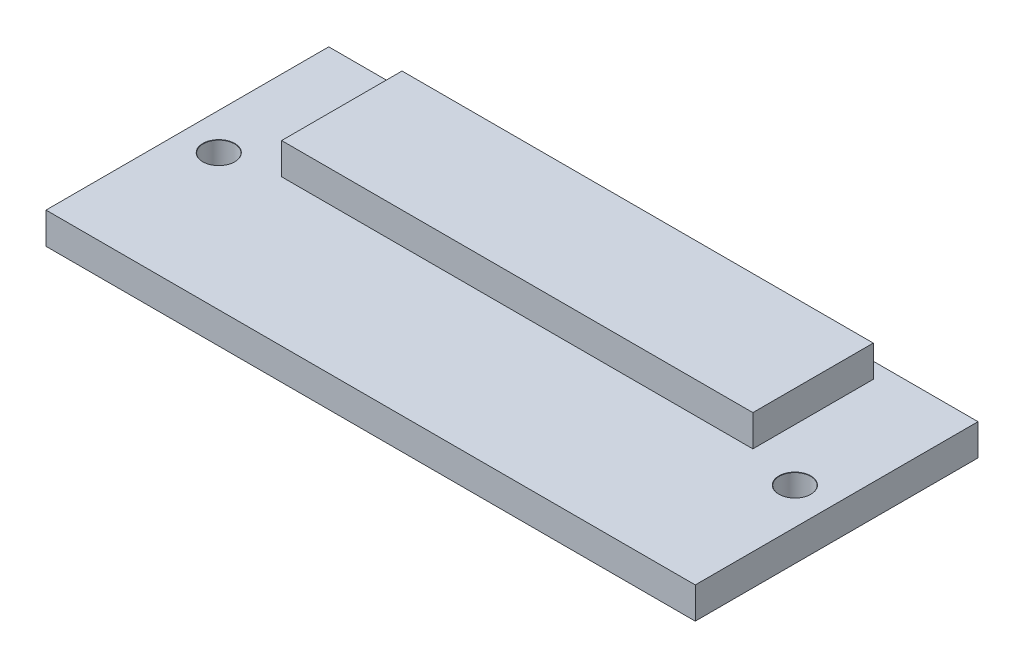
ISO-10303-21;
HEADER;
FILE_DESCRIPTION(('STEP AP214'),'2;1');
FILE_NAME('part.step','',(''),(''),'','','');
FILE_SCHEMA(('AUTOMOTIVE_DESIGN { 1 0 10303 214 1 1 1 1 }'));
ENDSEC;
DATA;
#1=APPLICATION_CONTEXT('core data for automotive mechanical design processes');
#2=APPLICATION_PROTOCOL_DEFINITION('international standard','automotive_design',2000,#1);
#3=PRODUCT_CONTEXT('',#1,'mechanical');
#4=PRODUCT('Part','Part','',(#3));
#5=PRODUCT_RELATED_PRODUCT_CATEGORY('part','',(#4));
#6=PRODUCT_DEFINITION_FORMATION('','',#4);
#7=PRODUCT_DEFINITION_CONTEXT('part definition',#1,'design');
#8=PRODUCT_DEFINITION('design','',#6,#7);
#9=PRODUCT_DEFINITION_SHAPE('','',#8);
#10=(LENGTH_UNIT() NAMED_UNIT(*) SI_UNIT(.MILLI.,.METRE.));
#11=(NAMED_UNIT(*) PLANE_ANGLE_UNIT() SI_UNIT($,.RADIAN.));
#12=(NAMED_UNIT(*) SI_UNIT($,.STERADIAN.) SOLID_ANGLE_UNIT());
#13=UNCERTAINTY_MEASURE_WITH_UNIT(LENGTH_MEASURE(1.E-05),#10,'distance_accuracy_value','');
#14=(GEOMETRIC_REPRESENTATION_CONTEXT(3) GLOBAL_UNCERTAINTY_ASSIGNED_CONTEXT((#13)) GLOBAL_UNIT_ASSIGNED_CONTEXT((#10,
#11,#12)) REPRESENTATION_CONTEXT('',''));
#15=CARTESIAN_POINT('',(0.,0.,0.));
#16=DIRECTION('',(0.,0.,1.));
#17=DIRECTION('',(1.,0.,0.));
#18=AXIS2_PLACEMENT_3D('',#15,#16,#17);
#19=CARTESIAN_POINT('',(8.5,6.,-25.5));
#20=DIRECTION('',(1.,0.,0.));
#21=DIRECTION('',(0.,0.,-1.));
#22=AXIS2_PLACEMENT_3D('',#19,#20,#21);
#23=PLANE('',#22);
#24=DIRECTION('',(0.,0.,1.));
#25=VECTOR('',#24,1.);
#26=CARTESIAN_POINT('',(8.5,3.,-25.5));
#27=LINE('',#26,#25);
#28=CARTESIAN_POINT('',(8.5,3.,-25.5));
#29=VERTEX_POINT('',#28);
#30=CARTESIAN_POINT('',(8.5,3.,-14.));
#31=VERTEX_POINT('',#30);
#32=EDGE_CURVE('E112',#29,#31,#27,.T.);
#33=ORIENTED_EDGE('',*,*,#32,.T.);
#34=DIRECTION('',(0.,-1.,0.));
#35=VECTOR('',#34,1.);
#36=CARTESIAN_POINT('',(8.5,6.,-14.));
#37=LINE('',#36,#35);
#38=CARTESIAN_POINT('',(8.5,6.,-14.));
#39=VERTEX_POINT('',#38);
#40=EDGE_CURVE('E12',#39,#31,#37,.T.);
#41=ORIENTED_EDGE('',*,*,#40,.F.);
#42=DIRECTION('',(0.,0.,1.));
#43=VECTOR('',#42,1.);
#44=CARTESIAN_POINT('',(8.5,6.,-25.5));
#45=LINE('',#44,#43);
#46=CARTESIAN_POINT('',(8.5,6.,-25.5));
#47=VERTEX_POINT('',#46);
#48=EDGE_CURVE('E100',#47,#39,#45,.T.);
#49=ORIENTED_EDGE('',*,*,#48,.F.);
#50=DIRECTION('',(0.,-1.,0.));
#51=VECTOR('',#50,1.);
#52=CARTESIAN_POINT('',(8.5,6.,-25.5));
#53=LINE('',#52,#51);
#54=EDGE_CURVE('E108',#47,#29,#53,.T.);
#55=ORIENTED_EDGE('',*,*,#54,.T.);
#56=EDGE_LOOP('',(#33,#41,#49,#55));
#57=FACE_BOUND('',#56,.T.);
#58=ADVANCED_FACE('F49',(#57),#23,.F.);
#59=CARTESIAN_POINT('',(8.5,6.,-14.));
#60=DIRECTION('',(0.,0.,-1.));
#61=DIRECTION('',(-1.,0.,0.));
#62=AXIS2_PLACEMENT_3D('',#59,#60,#61);
#63=PLANE('',#62);
#64=DIRECTION('',(1.,0.,0.));
#65=VECTOR('',#64,1.);
#66=CARTESIAN_POINT('',(8.5,3.,-14.));
#67=LINE('',#66,#65);
#68=CARTESIAN_POINT('',(53.5,3.,-14.));
#69=VERTEX_POINT('',#68);
#70=EDGE_CURVE('E104',#31,#69,#67,.T.);
#71=ORIENTED_EDGE('',*,*,#70,.T.);
#72=DIRECTION('',(0.,-1.,0.));
#73=VECTOR('',#72,1.);
#74=CARTESIAN_POINT('',(53.5,6.,-14.));
#75=LINE('',#74,#73);
#76=CARTESIAN_POINT('',(53.5,6.,-14.));
#77=VERTEX_POINT('',#76);
#78=EDGE_CURVE('E57',#77,#69,#75,.T.);
#79=ORIENTED_EDGE('',*,*,#78,.F.);
#80=DIRECTION('',(1.,0.,0.));
#81=VECTOR('',#80,1.);
#82=CARTESIAN_POINT('',(8.5,6.,-14.));
#83=LINE('',#82,#81);
#84=EDGE_CURVE('E95',#39,#77,#83,.T.);
#85=ORIENTED_EDGE('',*,*,#84,.F.);
#86=ORIENTED_EDGE('',*,*,#40,.T.);
#87=EDGE_LOOP('',(#71,#79,#85,#86));
#88=FACE_BOUND('',#87,.T.);
#89=ADVANCED_FACE('F103',(#88),#63,.F.);
#90=CARTESIAN_POINT('',(53.5,6.,-25.5));
#91=DIRECTION('',(-1.,0.,0.));
#92=DIRECTION('',(0.,0.,1.));
#93=AXIS2_PLACEMENT_3D('',#90,#91,#92);
#94=PLANE('',#93);
#95=DIRECTION('',(0.,0.,-1.));
#96=VECTOR('',#95,1.);
#97=CARTESIAN_POINT('',(53.5,3.,-25.5));
#98=LINE('',#97,#96);
#99=CARTESIAN_POINT('',(53.5,3.,-25.5));
#100=VERTEX_POINT('',#99);
#101=EDGE_CURVE('E82',#69,#100,#98,.T.);
#102=ORIENTED_EDGE('',*,*,#101,.T.);
#103=DIRECTION('',(0.,-1.,0.));
#104=VECTOR('',#103,1.);
#105=CARTESIAN_POINT('',(53.5,6.,-25.5));
#106=LINE('',#105,#104);
#107=CARTESIAN_POINT('',(53.5,6.,-25.5));
#108=VERTEX_POINT('',#107);
#109=EDGE_CURVE('E105',#108,#100,#106,.T.);
#110=ORIENTED_EDGE('',*,*,#109,.F.);
#111=DIRECTION('',(0.,0.,-1.));
#112=VECTOR('',#111,1.);
#113=CARTESIAN_POINT('',(53.5,6.,-25.5));
#114=LINE('',#113,#112);
#115=EDGE_CURVE('E98',#77,#108,#114,.T.);
#116=ORIENTED_EDGE('',*,*,#115,.F.);
#117=ORIENTED_EDGE('',*,*,#78,.T.);
#118=EDGE_LOOP('',(#102,#110,#116,#117));
#119=FACE_BOUND('',#118,.T.);
#120=ADVANCED_FACE('F106',(#119),#94,.F.);
#121=CARTESIAN_POINT('',(8.5,6.,-25.5));
#122=DIRECTION('',(0.,0.,1.));
#123=DIRECTION('',(1.,0.,0.));
#124=AXIS2_PLACEMENT_3D('',#121,#122,#123);
#125=PLANE('',#124);
#126=DIRECTION('',(-1.,0.,0.));
#127=VECTOR('',#126,1.);
#128=CARTESIAN_POINT('',(8.5,3.,-25.5));
#129=LINE('',#128,#127);
#130=EDGE_CURVE('E88',#100,#29,#129,.T.);
#131=ORIENTED_EDGE('',*,*,#130,.T.);
#132=ORIENTED_EDGE('',*,*,#54,.F.);
#133=DIRECTION('',(-1.,0.,0.));
#134=VECTOR('',#133,1.);
#135=CARTESIAN_POINT('',(8.5,6.,-25.5));
#136=LINE('',#135,#134);
#137=EDGE_CURVE('E65',#108,#47,#136,.T.);
#138=ORIENTED_EDGE('',*,*,#137,.F.);
#139=ORIENTED_EDGE('',*,*,#109,.T.);
#140=EDGE_LOOP('',(#131,#132,#138,#139));
#141=FACE_BOUND('',#140,.T.);
#142=ADVANCED_FACE('F119',(#141),#125,.F.);
#143=CARTESIAN_POINT('',(0.,6.,0.));
#144=DIRECTION('',(0.,1.,0.));
#145=DIRECTION('',(0.,0.,1.));
#146=AXIS2_PLACEMENT_3D('',#143,#144,#145);
#147=PLANE('',#146);
#148=ORIENTED_EDGE('',*,*,#48,.T.);
#149=ORIENTED_EDGE('',*,*,#84,.T.);
#150=ORIENTED_EDGE('',*,*,#115,.T.);
#151=ORIENTED_EDGE('',*,*,#137,.T.);
#152=EDGE_LOOP('',(#148,#149,#150,#151));
#153=FACE_BOUND('',#152,.T.);
#154=ADVANCED_FACE('F96',(#153),#147,.T.);
#155=CARTESIAN_POINT('',(0.,3.,0.));
#156=DIRECTION('',(0.,1.,0.));
#157=DIRECTION('',(0.,0.,1.));
#158=AXIS2_PLACEMENT_3D('',#155,#156,#157);
#159=PLANE('',#158);
#160=ORIENTED_EDGE('',*,*,#32,.F.);
#161=ORIENTED_EDGE('',*,*,#130,.F.);
#162=ORIENTED_EDGE('',*,*,#101,.F.);
#163=ORIENTED_EDGE('',*,*,#70,.F.);
#164=EDGE_LOOP('',(#160,#161,#162,#163));
#165=FACE_BOUND('',#164,.T.);
#166=ADVANCED_FACE('F122',(#165),#159,.F.);
#167=CLOSED_SHELL('',(#58,#89,#120,#142,#154,#166));
#168=MANIFOLD_SOLID_BREP('B2',#167);
#169=CARTESIAN_POINT('',(0.,3.,0.));
#170=DIRECTION('',(0.,-1.,0.));
#171=DIRECTION('',(0.,0.,-1.));
#172=AXIS2_PLACEMENT_3D('',#169,#170,#171);
#173=PLANE('',#172);
#174=DIRECTION('',(1.,0.,0.));
#175=VECTOR('',#174,1.);
#176=CARTESIAN_POINT('',(8.5,3.,-14.));
#177=LINE('',#176,#175);
#178=CARTESIAN_POINT('',(8.5,3.,-14.));
#179=VERTEX_POINT('',#178);
#180=CARTESIAN_POINT('',(53.5,3.,-14.));
#181=VERTEX_POINT('',#180);
#182=EDGE_CURVE('E273',#179,#181,#177,.T.);
#183=ORIENTED_EDGE('',*,*,#182,.F.);
#184=DIRECTION('',(0.,0.,1.));
#185=VECTOR('',#184,1.);
#186=CARTESIAN_POINT('',(8.5,3.,-25.5));
#187=LINE('',#186,#185);
#188=CARTESIAN_POINT('',(8.5,3.,-25.5));
#189=VERTEX_POINT('',#188);
#190=EDGE_CURVE('E189',#189,#179,#187,.T.);
#191=ORIENTED_EDGE('',*,*,#190,.F.);
#192=DIRECTION('',(-1.,0.,0.));
#193=VECTOR('',#192,1.);
#194=CARTESIAN_POINT('',(8.5,3.,-25.5));
#195=LINE('',#194,#193);
#196=CARTESIAN_POINT('',(53.5,3.,-25.5));
#197=VERTEX_POINT('',#196);
#198=EDGE_CURVE('E260',#197,#189,#195,.T.);
#199=ORIENTED_EDGE('',*,*,#198,.F.);
#200=DIRECTION('',(0.,0.,-1.));
#201=VECTOR('',#200,1.);
#202=CARTESIAN_POINT('',(53.5,3.,-25.5));
#203=LINE('',#202,#201);
#204=EDGE_CURVE('E264',#181,#197,#203,.T.);
#205=ORIENTED_EDGE('',*,*,#204,.F.);
#206=EDGE_LOOP('',(#183,#191,#199,#205));
#207=FACE_BOUND('',#206,.T.);
#208=CARTESIAN_POINT('',(3.5,3.,-13.));
#209=DIRECTION('',(0.,1.,0.));
#210=DIRECTION('',(0.,0.,1.));
#211=AXIS2_PLACEMENT_3D('',#208,#209,#210);
#212=CIRCLE('',#211,1.525);
#213=CARTESIAN_POINT('',(3.5,3.,-11.475));
#214=VERTEX_POINT('',#213);
#215=EDGE_CURVE('E282',#214,#214,#212,.T.);
#216=ORIENTED_EDGE('',*,*,#215,.F.);
#217=EDGE_LOOP('',(#216));
#218=FACE_BOUND('',#217,.T.);
#219=DIRECTION('',(0.,0.,1.));
#220=VECTOR('',#219,1.);
#221=CARTESIAN_POINT('',(0.,3.,0.));
#222=LINE('',#221,#220);
#223=CARTESIAN_POINT('',(0.,3.,-27.));
#224=VERTEX_POINT('',#223);
#225=CARTESIAN_POINT('',(0.,3.,0.));
#226=VERTEX_POINT('',#225);
#227=EDGE_CURVE('E312',#224,#226,#222,.T.);
#228=ORIENTED_EDGE('',*,*,#227,.T.);
#229=DIRECTION('',(1.,0.,0.));
#230=VECTOR('',#229,1.);
#231=CARTESIAN_POINT('',(0.,3.,0.));
#232=LINE('',#231,#230);
#233=CARTESIAN_POINT('',(62.,3.,0.));
#234=VERTEX_POINT('',#233);
#235=EDGE_CURVE('E316',#226,#234,#232,.T.);
#236=ORIENTED_EDGE('',*,*,#235,.T.);
#237=DIRECTION('',(0.,0.,-1.));
#238=VECTOR('',#237,1.);
#239=CARTESIAN_POINT('',(62.,3.,0.));
#240=LINE('',#239,#238);
#241=CARTESIAN_POINT('',(62.,3.,-27.));
#242=VERTEX_POINT('',#241);
#243=EDGE_CURVE('E320',#234,#242,#240,.T.);
#244=ORIENTED_EDGE('',*,*,#243,.T.);
#245=DIRECTION('',(-1.,0.,0.));
#246=VECTOR('',#245,1.);
#247=CARTESIAN_POINT('',(0.,3.,-27.));
#248=LINE('',#247,#246);
#249=EDGE_CURVE('E323',#242,#224,#248,.T.);
#250=ORIENTED_EDGE('',*,*,#249,.T.);
#251=EDGE_LOOP('',(#228,#236,#244,#250));
#252=FACE_BOUND('',#251,.T.);
#253=CARTESIAN_POINT('',(58.4999981781058,3.,-13.0141565659629));
#254=DIRECTION('',(0.,1.,0.));
#255=DIRECTION('',(0.,0.,1.));
#256=AXIS2_PLACEMENT_3D('',#253,#254,#255);
#257=CIRCLE('',#256,1.525);
#258=CARTESIAN_POINT('',(58.4999981781058,3.,-11.4891565659629));
#259=VERTEX_POINT('',#258);
#260=EDGE_CURVE('E299',#259,#259,#257,.T.);
#261=ORIENTED_EDGE('',*,*,#260,.F.);
#262=EDGE_LOOP('',(#261));
#263=FACE_BOUND('',#262,.T.);
#264=ADVANCED_FACE('F173',(#207,#218,#252,#263),#173,.F.);
#265=CARTESIAN_POINT('',(0.,0.,0.));
#266=DIRECTION('',(0.,-1.,0.));
#267=DIRECTION('',(0.,0.,-1.));
#268=AXIS2_PLACEMENT_3D('',#265,#266,#267);
#269=PLANE('',#268);
#270=DIRECTION('',(0.,0.,1.));
#271=VECTOR('',#270,1.);
#272=CARTESIAN_POINT('',(8.5,0.,-25.5));
#273=LINE('',#272,#271);
#274=CARTESIAN_POINT('',(8.5,0.,-25.5));
#275=VERTEX_POINT('',#274);
#276=CARTESIAN_POINT('',(8.5,0.,-14.));
#277=VERTEX_POINT('',#276);
#278=EDGE_CURVE('E241',#275,#277,#273,.T.);
#279=ORIENTED_EDGE('',*,*,#278,.T.);
#280=DIRECTION('',(1.,0.,0.));
#281=VECTOR('',#280,1.);
#282=CARTESIAN_POINT('',(8.5,0.,-14.));
#283=LINE('',#282,#281);
#284=CARTESIAN_POINT('',(53.5,0.,-14.));
#285=VERTEX_POINT('',#284);
#286=EDGE_CURVE('E251',#277,#285,#283,.T.);
#287=ORIENTED_EDGE('',*,*,#286,.T.);
#288=DIRECTION('',(0.,0.,-1.));
#289=VECTOR('',#288,1.);
#290=CARTESIAN_POINT('',(53.5,0.,-25.5));
#291=LINE('',#290,#289);
#292=CARTESIAN_POINT('',(53.5,0.,-25.5));
#293=VERTEX_POINT('',#292);
#294=EDGE_CURVE('E197',#285,#293,#291,.T.);
#295=ORIENTED_EDGE('',*,*,#294,.T.);
#296=DIRECTION('',(-1.,0.,0.));
#297=VECTOR('',#296,1.);
#298=CARTESIAN_POINT('',(8.5,0.,-25.5));
#299=LINE('',#298,#297);
#300=EDGE_CURVE('E248',#293,#275,#299,.T.);
#301=ORIENTED_EDGE('',*,*,#300,.T.);
#302=EDGE_LOOP('',(#279,#287,#295,#301));
#303=FACE_BOUND('',#302,.T.);
#304=CARTESIAN_POINT('',(3.5,0.,-13.));
#305=DIRECTION('',(0.,1.,0.));
#306=DIRECTION('',(0.,0.,1.));
#307=AXIS2_PLACEMENT_3D('',#304,#305,#306);
#308=CIRCLE('',#307,1.5);
#309=CARTESIAN_POINT('',(3.5,0.,-11.5));
#310=VERTEX_POINT('',#309);
#311=EDGE_CURVE('E295',#310,#310,#308,.T.);
#312=ORIENTED_EDGE('',*,*,#311,.T.);
#313=EDGE_LOOP('',(#312));
#314=FACE_BOUND('',#313,.T.);
#315=DIRECTION('',(0.,0.,1.));
#316=VECTOR('',#315,1.);
#317=CARTESIAN_POINT('',(0.,0.,0.));
#318=LINE('',#317,#316);
#319=CARTESIAN_POINT('',(0.,0.,-27.));
#320=VERTEX_POINT('',#319);
#321=CARTESIAN_POINT('',(0.,0.,0.));
#322=VERTEX_POINT('',#321);
#323=EDGE_CURVE('E311',#320,#322,#318,.T.);
#324=ORIENTED_EDGE('',*,*,#323,.F.);
#325=DIRECTION('',(-1.,0.,0.));
#326=VECTOR('',#325,1.);
#327=CARTESIAN_POINT('',(0.,0.,-27.));
#328=LINE('',#327,#326);
#329=CARTESIAN_POINT('',(62.,0.,-27.));
#330=VERTEX_POINT('',#329);
#331=EDGE_CURVE('E317',#330,#320,#328,.T.);
#332=ORIENTED_EDGE('',*,*,#331,.F.);
#333=DIRECTION('',(0.,0.,-1.));
#334=VECTOR('',#333,1.);
#335=CARTESIAN_POINT('',(62.,0.,0.));
#336=LINE('',#335,#334);
#337=CARTESIAN_POINT('',(62.,0.,0.));
#338=VERTEX_POINT('',#337);
#339=EDGE_CURVE('E333',#338,#330,#336,.T.);
#340=ORIENTED_EDGE('',*,*,#339,.F.);
#341=DIRECTION('',(1.,0.,0.));
#342=VECTOR('',#341,1.);
#343=CARTESIAN_POINT('',(0.,0.,0.));
#344=LINE('',#343,#342);
#345=EDGE_CURVE('E330',#322,#338,#344,.T.);
#346=ORIENTED_EDGE('',*,*,#345,.F.);
#347=EDGE_LOOP('',(#324,#332,#340,#346));
#348=FACE_BOUND('',#347,.T.);
#349=CARTESIAN_POINT('',(58.4999981781058,0.,-13.0141565659629));
#350=DIRECTION('',(0.,1.,0.));
#351=DIRECTION('',(0.,0.,1.));
#352=AXIS2_PLACEMENT_3D('',#349,#350,#351);
#353=CIRCLE('',#352,1.5);
#354=CARTESIAN_POINT('',(58.4999981781058,0.,-11.5141565659629));
#355=VERTEX_POINT('',#354);
#356=EDGE_CURVE('E307',#355,#355,#353,.T.);
#357=ORIENTED_EDGE('',*,*,#356,.T.);
#358=EDGE_LOOP('',(#357));
#359=FACE_BOUND('',#358,.T.);
#360=ADVANCED_FACE('F256',(#303,#314,#348,#359),#269,.T.);
#361=CARTESIAN_POINT('',(0.,3.,0.));
#362=DIRECTION('',(1.,0.,0.));
#363=DIRECTION('',(0.,0.,-1.));
#364=AXIS2_PLACEMENT_3D('',#361,#362,#363);
#365=PLANE('',#364);
#366=ORIENTED_EDGE('',*,*,#323,.T.);
#367=DIRECTION('',(0.,-1.,0.));
#368=VECTOR('',#367,1.);
#369=CARTESIAN_POINT('',(0.,3.,0.));
#370=LINE('',#369,#368);
#371=EDGE_CURVE('E47',#226,#322,#370,.T.);
#372=ORIENTED_EDGE('',*,*,#371,.F.);
#373=ORIENTED_EDGE('',*,*,#227,.F.);
#374=DIRECTION('',(0.,-1.,0.));
#375=VECTOR('',#374,1.);
#376=CARTESIAN_POINT('',(0.,3.,-27.));
#377=LINE('',#376,#375);
#378=EDGE_CURVE('E326',#224,#320,#377,.T.);
#379=ORIENTED_EDGE('',*,*,#378,.T.);
#380=EDGE_LOOP('',(#366,#372,#373,#379));
#381=FACE_BOUND('',#380,.T.);
#382=ADVANCED_FACE('F175',(#381),#365,.F.);
#383=CARTESIAN_POINT('',(0.,3.,0.));
#384=DIRECTION('',(0.,0.,-1.));
#385=DIRECTION('',(-1.,0.,0.));
#386=AXIS2_PLACEMENT_3D('',#383,#384,#385);
#387=PLANE('',#386);
#388=ORIENTED_EDGE('',*,*,#345,.T.);
#389=DIRECTION('',(0.,-1.,0.));
#390=VECTOR('',#389,1.);
#391=CARTESIAN_POINT('',(62.,3.,0.));
#392=LINE('',#391,#390);
#393=EDGE_CURVE('E182',#234,#338,#392,.T.);
#394=ORIENTED_EDGE('',*,*,#393,.F.);
#395=ORIENTED_EDGE('',*,*,#235,.F.);
#396=ORIENTED_EDGE('',*,*,#371,.T.);
#397=EDGE_LOOP('',(#388,#394,#395,#396));
#398=FACE_BOUND('',#397,.T.);
#399=ADVANCED_FACE('F366',(#398),#387,.F.);
#400=CARTESIAN_POINT('',(62.,3.,0.));
#401=DIRECTION('',(-1.,0.,0.));
#402=DIRECTION('',(0.,0.,1.));
#403=AXIS2_PLACEMENT_3D('',#400,#401,#402);
#404=PLANE('',#403);
#405=ORIENTED_EDGE('',*,*,#339,.T.);
#406=DIRECTION('',(0.,-1.,0.));
#407=VECTOR('',#406,1.);
#408=CARTESIAN_POINT('',(62.,3.,-27.));
#409=LINE('',#408,#407);
#410=EDGE_CURVE('E341',#242,#330,#409,.T.);
#411=ORIENTED_EDGE('',*,*,#410,.F.);
#412=ORIENTED_EDGE('',*,*,#243,.F.);
#413=ORIENTED_EDGE('',*,*,#393,.T.);
#414=EDGE_LOOP('',(#405,#411,#412,#413));
#415=FACE_BOUND('',#414,.T.);
#416=ADVANCED_FACE('F350',(#415),#404,.F.);
#417=CARTESIAN_POINT('',(0.,3.,-27.));
#418=DIRECTION('',(0.,0.,1.));
#419=DIRECTION('',(1.,0.,0.));
#420=AXIS2_PLACEMENT_3D('',#417,#418,#419);
#421=PLANE('',#420);
#422=ORIENTED_EDGE('',*,*,#331,.T.);
#423=ORIENTED_EDGE('',*,*,#378,.F.);
#424=ORIENTED_EDGE('',*,*,#249,.F.);
#425=ORIENTED_EDGE('',*,*,#410,.T.);
#426=EDGE_LOOP('',(#422,#423,#424,#425));
#427=FACE_BOUND('',#426,.T.);
#428=ADVANCED_FACE('F359',(#427),#421,.F.);
#429=CARTESIAN_POINT('',(58.4999981781058,3.,-13.0141565659629));
#430=DIRECTION('',(0.,1.,0.));
#431=DIRECTION('',(0.,0.,1.));
#432=AXIS2_PLACEMENT_3D('',#429,#430,#431);
#433=CYLINDRICAL_SURFACE('',#432,1.5);
#434=ORIENTED_EDGE('',*,*,#356,.F.);
#435=EDGE_LOOP('',(#434));
#436=FACE_BOUND('',#435,.T.);
#437=CARTESIAN_POINT('',(58.4999981781058,2.975,-13.0141565659629));
#438=DIRECTION('',(0.,1.,0.));
#439=DIRECTION('',(0.,0.,1.));
#440=AXIS2_PLACEMENT_3D('',#437,#438,#439);
#441=CIRCLE('',#440,1.5);
#442=CARTESIAN_POINT('',(58.4999981781058,2.975,-11.5141565659629));
#443=VERTEX_POINT('',#442);
#444=EDGE_CURVE('E303',#443,#443,#441,.T.);
#445=ORIENTED_EDGE('',*,*,#444,.T.);
#446=EDGE_LOOP('',(#445));
#447=FACE_BOUND('',#446,.T.);
#448=ADVANCED_FACE('F382',(#436,#447),#433,.F.);
#449=CARTESIAN_POINT('',(58.4999981781058,3.,-13.0141565659629));
#450=DIRECTION('',(0.,1.,0.));
#451=DIRECTION('',(0.,0.,1.));
#452=AXIS2_PLACEMENT_3D('',#449,#450,#451);
#453=CONICAL_SURFACE('',#452,1.525,0.785398163397362);
#454=ORIENTED_EDGE('',*,*,#444,.F.);
#455=EDGE_LOOP('',(#454));
#456=FACE_BOUND('',#455,.T.);
#457=ORIENTED_EDGE('',*,*,#260,.T.);
#458=EDGE_LOOP('',(#457));
#459=FACE_BOUND('',#458,.T.);
#460=ADVANCED_FACE('F389',(#456,#459),#453,.F.);
#461=CARTESIAN_POINT('',(3.5,3.,-13.));
#462=DIRECTION('',(0.,1.,0.));
#463=DIRECTION('',(0.,0.,1.));
#464=AXIS2_PLACEMENT_3D('',#461,#462,#463);
#465=CYLINDRICAL_SURFACE('',#464,1.5);
#466=ORIENTED_EDGE('',*,*,#311,.F.);
#467=EDGE_LOOP('',(#466));
#468=FACE_BOUND('',#467,.T.);
#469=CARTESIAN_POINT('',(3.5,2.975,-13.));
#470=DIRECTION('',(0.,1.,0.));
#471=DIRECTION('',(0.,0.,1.));
#472=AXIS2_PLACEMENT_3D('',#469,#470,#471);
#473=CIRCLE('',#472,1.5);
#474=CARTESIAN_POINT('',(3.5,2.975,-11.5));
#475=VERTEX_POINT('',#474);
#476=EDGE_CURVE('E291',#475,#475,#473,.T.);
#477=ORIENTED_EDGE('',*,*,#476,.T.);
#478=EDGE_LOOP('',(#477));
#479=FACE_BOUND('',#478,.T.);
#480=ADVANCED_FACE('F394',(#468,#479),#465,.F.);
#481=CARTESIAN_POINT('',(3.5,3.,-13.));
#482=DIRECTION('',(0.,1.,0.));
#483=DIRECTION('',(0.,0.,1.));
#484=AXIS2_PLACEMENT_3D('',#481,#482,#483);
#485=CONICAL_SURFACE('',#484,1.525,0.785398163397414);
#486=ORIENTED_EDGE('',*,*,#476,.F.);
#487=EDGE_LOOP('',(#486));
#488=FACE_BOUND('',#487,.T.);
#489=ORIENTED_EDGE('',*,*,#215,.T.);
#490=EDGE_LOOP('',(#489));
#491=FACE_BOUND('',#490,.T.);
#492=ADVANCED_FACE('F404',(#488,#491),#485,.F.);
#493=CARTESIAN_POINT('',(8.5,0.,-25.5));
#494=DIRECTION('',(-1.,0.,0.));
#495=DIRECTION('',(0.,0.,1.));
#496=AXIS2_PLACEMENT_3D('',#493,#494,#495);
#497=PLANE('',#496);
#498=ORIENTED_EDGE('',*,*,#190,.T.);
#499=DIRECTION('',(0.,1.,0.));
#500=VECTOR('',#499,1.);
#501=CARTESIAN_POINT('',(8.5,0.,-14.));
#502=LINE('',#501,#500);
#503=EDGE_CURVE('E237',#277,#179,#502,.T.);
#504=ORIENTED_EDGE('',*,*,#503,.F.);
#505=ORIENTED_EDGE('',*,*,#278,.F.);
#506=DIRECTION('',(0.,1.,0.));
#507=VECTOR('',#506,1.);
#508=CARTESIAN_POINT('',(8.5,0.,-25.5));
#509=LINE('',#508,#507);
#510=EDGE_CURVE('E279',#275,#189,#509,.T.);
#511=ORIENTED_EDGE('',*,*,#510,.T.);
#512=EDGE_LOOP('',(#498,#504,#505,#511));
#513=FACE_BOUND('',#512,.T.);
#514=ADVANCED_FACE('F239',(#513),#497,.F.);
#515=CARTESIAN_POINT('',(8.5,0.,-25.5));
#516=DIRECTION('',(0.,0.,-1.));
#517=DIRECTION('',(-1.,0.,0.));
#518=AXIS2_PLACEMENT_3D('',#515,#516,#517);
#519=PLANE('',#518);
#520=ORIENTED_EDGE('',*,*,#198,.T.);
#521=ORIENTED_EDGE('',*,*,#510,.F.);
#522=ORIENTED_EDGE('',*,*,#300,.F.);
#523=DIRECTION('',(0.,1.,0.));
#524=VECTOR('',#523,1.);
#525=CARTESIAN_POINT('',(53.5,0.,-25.5));
#526=LINE('',#525,#524);
#527=EDGE_CURVE('E283',#293,#197,#526,.T.);
#528=ORIENTED_EDGE('',*,*,#527,.T.);
#529=EDGE_LOOP('',(#520,#521,#522,#528));
#530=FACE_BOUND('',#529,.T.);
#531=ADVANCED_FACE('F413',(#530),#519,.F.);
#532=CARTESIAN_POINT('',(53.5,0.,-25.5));
#533=DIRECTION('',(1.,0.,0.));
#534=DIRECTION('',(0.,0.,-1.));
#535=AXIS2_PLACEMENT_3D('',#532,#533,#534);
#536=PLANE('',#535);
#537=ORIENTED_EDGE('',*,*,#204,.T.);
#538=ORIENTED_EDGE('',*,*,#527,.F.);
#539=ORIENTED_EDGE('',*,*,#294,.F.);
#540=DIRECTION('',(0.,1.,0.));
#541=VECTOR('',#540,1.);
#542=CARTESIAN_POINT('',(53.5,0.,-14.));
#543=LINE('',#542,#541);
#544=EDGE_CURVE('E247',#285,#181,#543,.T.);
#545=ORIENTED_EDGE('',*,*,#544,.T.);
#546=EDGE_LOOP('',(#537,#538,#539,#545));
#547=FACE_BOUND('',#546,.T.);
#548=ADVANCED_FACE('F416',(#547),#536,.F.);
#549=CARTESIAN_POINT('',(8.5,0.,-14.));
#550=DIRECTION('',(0.,0.,1.));
#551=DIRECTION('',(1.,0.,0.));
#552=AXIS2_PLACEMENT_3D('',#549,#550,#551);
#553=PLANE('',#552);
#554=ORIENTED_EDGE('',*,*,#182,.T.);
#555=ORIENTED_EDGE('',*,*,#544,.F.);
#556=ORIENTED_EDGE('',*,*,#286,.F.);
#557=ORIENTED_EDGE('',*,*,#503,.T.);
#558=EDGE_LOOP('',(#554,#555,#556,#557));
#559=FACE_BOUND('',#558,.T.);
#560=ADVANCED_FACE('F252',(#559),#553,.F.);
#561=CLOSED_SHELL('',(#264,#360,#382,#399,#416,#428,#448,#460,#480,#492,#514,#531,#548,#560));
#562=MANIFOLD_SOLID_BREP('B6',#561);
#563=ADVANCED_BREP_SHAPE_REPRESENTATION('',(#18,#168,#562),#14);
#564=SHAPE_DEFINITION_REPRESENTATION(#9,#563);
ENDSEC;
END-ISO-10303-21;
